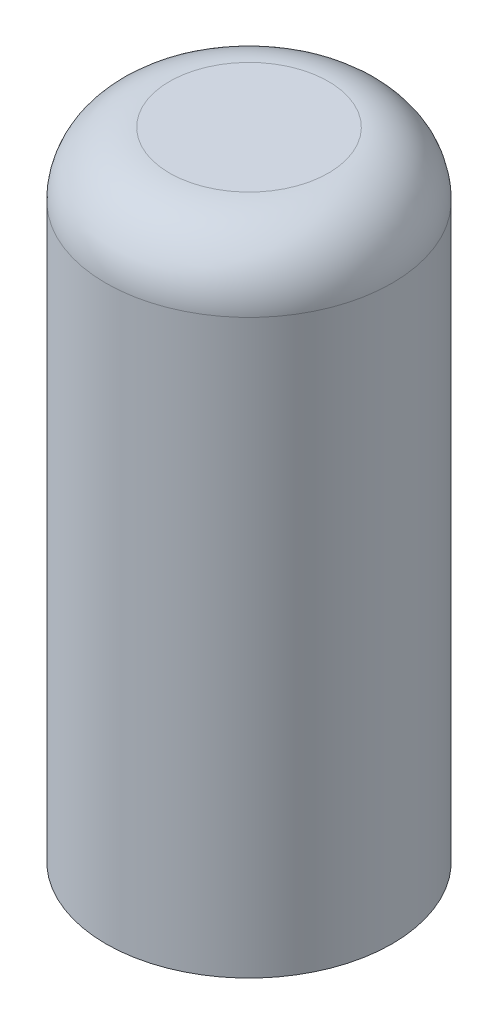
ISO-10303-21;
HEADER;
FILE_DESCRIPTION(('STEP AP214'),'2;1');
FILE_NAME('part.step','',(''),(''),'','','');
FILE_SCHEMA(('AUTOMOTIVE_DESIGN { 1 0 10303 214 1 1 1 1 }'));
ENDSEC;
DATA;
#1=APPLICATION_CONTEXT('core data for automotive mechanical design processes');
#2=APPLICATION_PROTOCOL_DEFINITION('international standard','automotive_design',2000,#1);
#3=PRODUCT_CONTEXT('',#1,'mechanical');
#4=PRODUCT('Part','Part','',(#3));
#5=PRODUCT_RELATED_PRODUCT_CATEGORY('part','',(#4));
#6=PRODUCT_DEFINITION_FORMATION('','',#4);
#7=PRODUCT_DEFINITION_CONTEXT('part definition',#1,'design');
#8=PRODUCT_DEFINITION('design','',#6,#7);
#9=PRODUCT_DEFINITION_SHAPE('','',#8);
#10=(LENGTH_UNIT() NAMED_UNIT(*) SI_UNIT(.MILLI.,.METRE.));
#11=(NAMED_UNIT(*) PLANE_ANGLE_UNIT() SI_UNIT($,.RADIAN.));
#12=(NAMED_UNIT(*) SI_UNIT($,.STERADIAN.) SOLID_ANGLE_UNIT());
#13=UNCERTAINTY_MEASURE_WITH_UNIT(LENGTH_MEASURE(1.E-05),#10,'distance_accuracy_value','');
#14=(GEOMETRIC_REPRESENTATION_CONTEXT(3) GLOBAL_UNCERTAINTY_ASSIGNED_CONTEXT((#13)) GLOBAL_UNIT_ASSIGNED_CONTEXT((#10,
#11,#12)) REPRESENTATION_CONTEXT('',''));
#15=CARTESIAN_POINT('',(0.,0.,0.));
#16=DIRECTION('',(0.,0.,1.));
#17=DIRECTION('',(1.,0.,0.));
#18=AXIS2_PLACEMENT_3D('',#15,#16,#17);
#19=CARTESIAN_POINT('',(0.,2.,0.));
#20=DIRECTION('',(0.,-1.,0.));
#21=DIRECTION('',(0.,0.,-1.));
#22=AXIS2_PLACEMENT_3D('',#19,#20,#21);
#23=CYLINDRICAL_SURFACE('',#22,0.45);
#24=CARTESIAN_POINT('',(0.,1.8,0.));
#25=DIRECTION('',(0.,1.,0.));
#26=DIRECTION('',(0.,0.,1.));
#27=AXIS2_PLACEMENT_3D('',#24,#25,#26);
#28=CIRCLE('',#27,0.45);
#29=CARTESIAN_POINT('',(0.,1.8,0.45));
#30=VERTEX_POINT('',#29);
#31=EDGE_CURVE('E10',#30,#30,#28,.F.);
#32=ORIENTED_EDGE('',*,*,#31,.T.);
#33=EDGE_LOOP('',(#32));
#34=FACE_BOUND('',#33,.T.);
#35=CARTESIAN_POINT('',(0.,0.,0.));
#36=DIRECTION('',(0.,1.,0.));
#37=DIRECTION('',(0.,0.,1.));
#38=AXIS2_PLACEMENT_3D('',#35,#36,#37);
#39=CIRCLE('',#38,0.45);
#40=CARTESIAN_POINT('',(0.,0.,0.45));
#41=VERTEX_POINT('',#40);
#42=EDGE_CURVE('E50',#41,#41,#39,.T.);
#43=ORIENTED_EDGE('',*,*,#42,.T.);
#44=EDGE_LOOP('',(#43));
#45=FACE_BOUND('',#44,.T.);
#46=ADVANCED_FACE('F37',(#34,#45),#23,.T.);
#47=CARTESIAN_POINT('',(0.,2.,0.));
#48=DIRECTION('',(0.,1.,0.));
#49=DIRECTION('',(0.,0.,1.));
#50=AXIS2_PLACEMENT_3D('',#47,#48,#49);
#51=PLANE('',#50);
#52=CARTESIAN_POINT('',(0.,2.,0.));
#53=DIRECTION('',(0.,1.,0.));
#54=DIRECTION('',(0.,0.,1.));
#55=AXIS2_PLACEMENT_3D('',#52,#53,#54);
#56=CIRCLE('',#55,0.25);
#57=CARTESIAN_POINT('',(0.,2.,0.25));
#58=VERTEX_POINT('',#57);
#59=EDGE_CURVE('E45',#58,#58,#56,.T.);
#60=ORIENTED_EDGE('',*,*,#59,.T.);
#61=EDGE_LOOP('',(#60));
#62=FACE_BOUND('',#61,.T.);
#63=ADVANCED_FACE('F61',(#62),#51,.T.);
#64=CARTESIAN_POINT('',(0.,0.,0.));
#65=DIRECTION('',(0.,1.,0.));
#66=DIRECTION('',(0.,0.,1.));
#67=AXIS2_PLACEMENT_3D('',#64,#65,#66);
#68=PLANE('',#67);
#69=ORIENTED_EDGE('',*,*,#42,.F.);
#70=EDGE_LOOP('',(#69));
#71=FACE_BOUND('',#70,.T.);
#72=ADVANCED_FACE('F59',(#71),#68,.F.);
#73=CARTESIAN_POINT('',(0.,1.8,0.));
#74=DIRECTION('',(0.,1.,0.));
#75=DIRECTION('',(0.,0.,1.));
#76=AXIS2_PLACEMENT_3D('',#73,#74,#75);
#77=TOROIDAL_SURFACE('',#76,0.25,0.2);
#78=ORIENTED_EDGE('',*,*,#31,.F.);
#79=EDGE_LOOP('',(#78));
#80=FACE_BOUND('',#79,.T.);
#81=ORIENTED_EDGE('',*,*,#59,.F.);
#82=EDGE_LOOP('',(#81));
#83=FACE_BOUND('',#82,.T.);
#84=ADVANCED_FACE('F39',(#80,#83),#77,.T.);
#85=CLOSED_SHELL('',(#46,#63,#72,#84));
#86=MANIFOLD_SOLID_BREP('B2',#85);
#87=ADVANCED_BREP_SHAPE_REPRESENTATION('',(#18,#86),#14);
#88=SHAPE_DEFINITION_REPRESENTATION(#9,#87);
ENDSEC;
END-ISO-10303-21;
